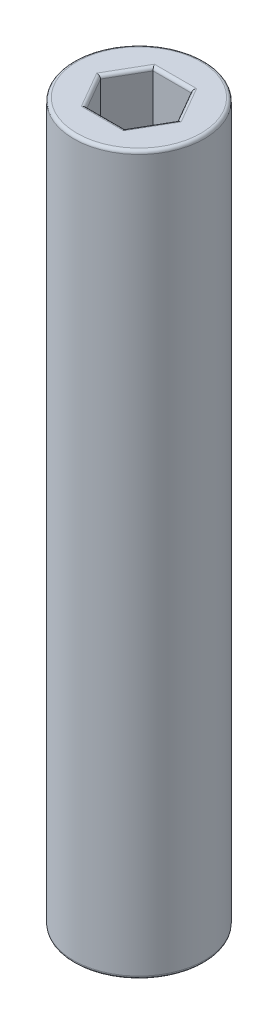
ISO-10303-21;
HEADER;
FILE_DESCRIPTION(('STEP AP214'),'2;1');
FILE_NAME('part.step','',(''),(''),'','','');
FILE_SCHEMA(('AUTOMOTIVE_DESIGN { 1 0 10303 214 1 1 1 1 }'));
ENDSEC;
DATA;
#1=APPLICATION_CONTEXT('core data for automotive mechanical design processes');
#2=APPLICATION_PROTOCOL_DEFINITION('international standard','automotive_design',2000,#1);
#3=PRODUCT_CONTEXT('',#1,'mechanical');
#4=PRODUCT('Part','Part','',(#3));
#5=PRODUCT_RELATED_PRODUCT_CATEGORY('part','',(#4));
#6=PRODUCT_DEFINITION_FORMATION('','',#4);
#7=PRODUCT_DEFINITION_CONTEXT('part definition',#1,'design');
#8=PRODUCT_DEFINITION('design','',#6,#7);
#9=PRODUCT_DEFINITION_SHAPE('','',#8);
#10=(LENGTH_UNIT() NAMED_UNIT(*) SI_UNIT(.MILLI.,.METRE.));
#11=(NAMED_UNIT(*) PLANE_ANGLE_UNIT() SI_UNIT($,.RADIAN.));
#12=(NAMED_UNIT(*) SI_UNIT($,.STERADIAN.) SOLID_ANGLE_UNIT());
#13=UNCERTAINTY_MEASURE_WITH_UNIT(LENGTH_MEASURE(1.E-05),#10,'distance_accuracy_value','');
#14=(GEOMETRIC_REPRESENTATION_CONTEXT(3) GLOBAL_UNCERTAINTY_ASSIGNED_CONTEXT((#13)) GLOBAL_UNIT_ASSIGNED_CONTEXT((#10,
#11,#12)) REPRESENTATION_CONTEXT('',''));
#15=CARTESIAN_POINT('',(0.,0.,0.));
#16=DIRECTION('',(0.,0.,1.));
#17=DIRECTION('',(1.,0.,0.));
#18=AXIS2_PLACEMENT_3D('',#15,#16,#17);
#19=CARTESIAN_POINT('',(0.,139.7,0.));
#20=DIRECTION('',(0.,1.,0.));
#21=DIRECTION('',(0.,0.,1.));
#22=AXIS2_PLACEMENT_3D('',#19,#20,#21);
#23=PLANE('',#22);
#24=DIRECTION('',(-0.499999999999995,0.,0.866025403784442));
#25=VECTOR('',#24,1.);
#26=CARTESIAN_POINT('',(-6.15917267171495,139.7,-3.55599999999996));
#27=LINE('',#26,#25);
#28=CARTESIAN_POINT('',(-8.21223022895324,139.7,0.));
#29=VERTEX_POINT('',#28);
#30=CARTESIAN_POINT('',(-4.10611511447665,139.7,-7.11199999999999));
#31=VERTEX_POINT('',#30);
#32=EDGE_CURVE('E198',#29,#31,#27,.F.);
#33=ORIENTED_EDGE('',*,*,#32,.T.);
#34=DIRECTION('',(-1.,0.,0.));
#35=VECTOR('',#34,1.);
#36=CARTESIAN_POINT('',(0.,139.7,-7.112));
#37=LINE('',#36,#35);
#38=CARTESIAN_POINT('',(4.1061151144766,139.7,-7.11200000000001));
#39=VERTEX_POINT('',#38);
#40=EDGE_CURVE('E201',#31,#39,#37,.F.);
#41=ORIENTED_EDGE('',*,*,#40,.T.);
#42=DIRECTION('',(-0.500000000000001,0.,-0.866025403784438));
#43=VECTOR('',#42,1.);
#44=CARTESIAN_POINT('',(6.15917267171492,139.7,-3.55600000000001));
#45=LINE('',#44,#43);
#46=CARTESIAN_POINT('',(8.21223022895324,139.7,0.));
#47=VERTEX_POINT('',#46);
#48=EDGE_CURVE('E166',#39,#47,#45,.F.);
#49=ORIENTED_EDGE('',*,*,#48,.T.);
#50=DIRECTION('',(0.499999999999995,0.,-0.866025403784442));
#51=VECTOR('',#50,1.);
#52=CARTESIAN_POINT('',(6.15917267171497,139.7,3.55599999999998));
#53=LINE('',#52,#51);
#54=CARTESIAN_POINT('',(4.1061151144767,139.7,7.11199999999996));
#55=VERTEX_POINT('',#54);
#56=EDGE_CURVE('E189',#47,#55,#53,.F.);
#57=ORIENTED_EDGE('',*,*,#56,.T.);
#58=DIRECTION('',(1.,0.,0.));
#59=VECTOR('',#58,1.);
#60=CARTESIAN_POINT('',(0.,139.7,7.112));
#61=LINE('',#60,#59);
#62=CARTESIAN_POINT('',(-4.10611511447655,139.7,7.11200000000004));
#63=VERTEX_POINT('',#62);
#64=EDGE_CURVE('E192',#55,#63,#61,.F.);
#65=ORIENTED_EDGE('',*,*,#64,.T.);
#66=DIRECTION('',(0.500000000000007,0.,0.866025403784435));
#67=VECTOR('',#66,1.);
#68=CARTESIAN_POINT('',(-6.1591726717149,139.7,3.55600000000005));
#69=LINE('',#68,#67);
#70=EDGE_CURVE('E195',#63,#29,#69,.F.);
#71=ORIENTED_EDGE('',*,*,#70,.T.);
#72=EDGE_LOOP('',(#33,#41,#49,#57,#65,#71));
#73=FACE_BOUND('',#72,.T.);
#74=CARTESIAN_POINT('',(0.,139.7,0.));
#75=DIRECTION('',(0.,1.,0.));
#76=DIRECTION('',(0.,0.,1.));
#77=AXIS2_PLACEMENT_3D('',#74,#75,#76);
#78=CIRCLE('',#77,12.065);
#79=CARTESIAN_POINT('',(0.,139.7,12.065));
#80=VERTEX_POINT('',#79);
#81=EDGE_CURVE('E178',#80,#80,#78,.T.);
#82=ORIENTED_EDGE('',*,*,#81,.T.);
#83=EDGE_LOOP('',(#82));
#84=FACE_BOUND('',#83,.T.);
#85=ADVANCED_FACE('F45',(#73,#84),#23,.T.);
#86=CARTESIAN_POINT('',(0.,0.,0.));
#87=DIRECTION('',(0.,1.,0.));
#88=DIRECTION('',(0.,0.,1.));
#89=AXIS2_PLACEMENT_3D('',#86,#87,#88);
#90=PLANE('',#89);
#91=DIRECTION('',(0.500000000000007,0.,0.866025403784435));
#92=VECTOR('',#91,1.);
#93=CARTESIAN_POINT('',(-4.28942382494426,0.,6.79450000000004));
#94=LINE('',#93,#92);
#95=CARTESIAN_POINT('',(-8.21223022895324,0.,0.));
#96=VERTEX_POINT('',#95);
#97=CARTESIAN_POINT('',(-4.10611511447655,0.,7.11200000000004));
#98=VERTEX_POINT('',#97);
#99=EDGE_CURVE('E55',#96,#98,#94,.T.);
#100=ORIENTED_EDGE('',*,*,#99,.T.);
#101=DIRECTION('',(1.,0.,0.));
#102=VECTOR('',#101,1.);
#103=CARTESIAN_POINT('',(3.73949769354129,0.,7.11199999999996));
#104=LINE('',#103,#102);
#105=CARTESIAN_POINT('',(4.1061151144767,0.,7.11199999999996));
#106=VERTEX_POINT('',#105);
#107=EDGE_CURVE('E11',#98,#106,#104,.T.);
#108=ORIENTED_EDGE('',*,*,#107,.T.);
#109=DIRECTION('',(0.499999999999995,0.,-0.866025403784442));
#110=VECTOR('',#109,1.);
#111=CARTESIAN_POINT('',(8.02892151848554,0.,0.317499999999996));
#112=LINE('',#111,#110);
#113=CARTESIAN_POINT('',(8.21223022895324,0.,0.));
#114=VERTEX_POINT('',#113);
#115=EDGE_CURVE('E242',#106,#114,#112,.T.);
#116=ORIENTED_EDGE('',*,*,#115,.T.);
#117=DIRECTION('',(-0.500000000000001,0.,-0.866025403784438));
#118=VECTOR('',#117,1.);
#119=CARTESIAN_POINT('',(4.28942382494431,0.,-6.79450000000001));
#120=LINE('',#119,#118);
#121=CARTESIAN_POINT('',(4.10611511447661,0.,-7.11200000000001));
#122=VERTEX_POINT('',#121);
#123=EDGE_CURVE('E245',#114,#122,#120,.T.);
#124=ORIENTED_EDGE('',*,*,#123,.T.);
#125=DIRECTION('',(-1.,0.,0.));
#126=VECTOR('',#125,1.);
#127=CARTESIAN_POINT('',(-3.73949769354124,0.,-7.11199999999999));
#128=LINE('',#127,#126);
#129=CARTESIAN_POINT('',(-4.10611511447665,0.,-7.11199999999999));
#130=VERTEX_POINT('',#129);
#131=EDGE_CURVE('E248',#122,#130,#128,.T.);
#132=ORIENTED_EDGE('',*,*,#131,.T.);
#133=DIRECTION('',(-0.499999999999995,0.,0.866025403784442));
#134=VECTOR('',#133,1.);
#135=CARTESIAN_POINT('',(-8.02892151848554,0.,-0.317499999999944));
#136=LINE('',#135,#134);
#137=EDGE_CURVE('E66',#130,#96,#136,.T.);
#138=ORIENTED_EDGE('',*,*,#137,.T.);
#139=EDGE_LOOP('',(#100,#108,#116,#124,#132,#138));
#140=FACE_BOUND('',#139,.T.);
#141=CARTESIAN_POINT('',(0.,0.,0.));
#142=DIRECTION('',(0.,1.,0.));
#143=DIRECTION('',(0.,0.,1.));
#144=AXIS2_PLACEMENT_3D('',#141,#142,#143);
#145=CIRCLE('',#144,12.065);
#146=CARTESIAN_POINT('',(0.,0.,12.065));
#147=VERTEX_POINT('',#146);
#148=EDGE_CURVE('E238',#147,#147,#145,.F.);
#149=ORIENTED_EDGE('',*,*,#148,.T.);
#150=EDGE_LOOP('',(#149));
#151=FACE_BOUND('',#150,.T.);
#152=ADVANCED_FACE('F335',(#140,#151),#90,.F.);
#153=CARTESIAN_POINT('',(0.,139.7,0.));
#154=DIRECTION('',(0.,-1.,0.));
#155=DIRECTION('',(0.,0.,-1.));
#156=AXIS2_PLACEMENT_3D('',#153,#154,#155);
#157=CYLINDRICAL_SURFACE('',#156,12.7);
#158=CARTESIAN_POINT('',(0.,139.065,0.));
#159=DIRECTION('',(0.,1.,0.));
#160=DIRECTION('',(0.,0.,1.));
#161=AXIS2_PLACEMENT_3D('',#158,#159,#160);
#162=CIRCLE('',#161,12.7);
#163=CARTESIAN_POINT('',(0.,139.065,12.7));
#164=VERTEX_POINT('',#163);
#165=EDGE_CURVE('E234',#164,#164,#162,.F.);
#166=ORIENTED_EDGE('',*,*,#165,.T.);
#167=EDGE_LOOP('',(#166));
#168=FACE_BOUND('',#167,.T.);
#169=CARTESIAN_POINT('',(0.,0.634999999999997,0.));
#170=DIRECTION('',(0.,1.,0.));
#171=DIRECTION('',(0.,0.,1.));
#172=AXIS2_PLACEMENT_3D('',#169,#170,#171);
#173=CIRCLE('',#172,12.7);
#174=CARTESIAN_POINT('',(0.,0.634999999999997,12.7));
#175=VERTEX_POINT('',#174);
#176=EDGE_CURVE('E148',#175,#175,#173,.T.);
#177=ORIENTED_EDGE('',*,*,#176,.T.);
#178=EDGE_LOOP('',(#177));
#179=FACE_BOUND('',#178,.T.);
#180=ADVANCED_FACE('F338',(#168,#179),#157,.T.);
#181=CARTESIAN_POINT('',(3.73949769354128,139.7,6.47699999999996));
#182=DIRECTION('',(-0.866025403784442,0.,-0.499999999999995));
#183=DIRECTION('',(-0.499999999999995,0.,0.866025403784442));
#184=AXIS2_PLACEMENT_3D('',#181,#182,#183);
#185=PLANE('',#184);
#186=DIRECTION('',(0.,-1.,0.));
#187=VECTOR('',#186,1.);
#188=CARTESIAN_POINT('',(3.73949769354128,139.7,6.47699999999996));
#189=LINE('',#188,#187);
#190=CARTESIAN_POINT('',(3.73949769354128,139.065,6.47699999999996));
#191=VERTEX_POINT('',#190);
#192=CARTESIAN_POINT('',(3.73949769354128,0.634999999999997,6.47699999999996));
#193=VERTEX_POINT('',#192);
#194=EDGE_CURVE('E271',#191,#193,#189,.T.);
#195=ORIENTED_EDGE('',*,*,#194,.F.);
#196=DIRECTION('',(0.499999999999995,0.,-0.866025403784442));
#197=VECTOR('',#196,1.);
#198=CARTESIAN_POINT('',(3.73949769354128,139.065,6.47699999999996));
#199=LINE('',#198,#197);
#200=CARTESIAN_POINT('',(7.47899538708242,139.065,0.));
#201=VERTEX_POINT('',#200);
#202=EDGE_CURVE('E226',#191,#201,#199,.T.);
#203=ORIENTED_EDGE('',*,*,#202,.T.);
#204=DIRECTION('',(0.,-1.,0.));
#205=VECTOR('',#204,1.);
#206=CARTESIAN_POINT('',(7.47899538708242,139.7,0.));
#207=LINE('',#206,#205);
#208=CARTESIAN_POINT('',(7.47899538708242,0.634999999999997,0.));
#209=VERTEX_POINT('',#208);
#210=EDGE_CURVE('E142',#201,#209,#207,.T.);
#211=ORIENTED_EDGE('',*,*,#210,.T.);
#212=DIRECTION('',(0.499999999999995,0.,-0.866025403784442));
#213=VECTOR('',#212,1.);
#214=CARTESIAN_POINT('',(3.73949769354128,0.635,6.47699999999996));
#215=LINE('',#214,#213);
#216=EDGE_CURVE('E223',#209,#193,#215,.F.);
#217=ORIENTED_EDGE('',*,*,#216,.T.);
#218=EDGE_LOOP('',(#195,#203,#211,#217));
#219=FACE_BOUND('',#218,.T.);
#220=ADVANCED_FACE('F305',(#219),#185,.T.);
#221=CARTESIAN_POINT('',(7.47899538708242,139.7,0.));
#222=DIRECTION('',(-0.866025403784438,0.,0.500000000000001));
#223=DIRECTION('',(0.500000000000001,0.,0.866025403784438));
#224=AXIS2_PLACEMENT_3D('',#221,#222,#223);
#225=PLANE('',#224);
#226=ORIENTED_EDGE('',*,*,#210,.F.);
#227=DIRECTION('',(-0.500000000000001,0.,-0.866025403784438));
#228=VECTOR('',#227,1.);
#229=CARTESIAN_POINT('',(7.47899538708242,139.065,0.));
#230=LINE('',#229,#228);
#231=CARTESIAN_POINT('',(3.73949769354119,139.065,-6.47700000000001));
#232=VERTEX_POINT('',#231);
#233=EDGE_CURVE('E136',#201,#232,#230,.T.);
#234=ORIENTED_EDGE('',*,*,#233,.T.);
#235=DIRECTION('',(0.,-1.,0.));
#236=VECTOR('',#235,1.);
#237=CARTESIAN_POINT('',(3.73949769354119,139.7,-6.47700000000001));
#238=LINE('',#237,#236);
#239=CARTESIAN_POINT('',(3.73949769354119,0.634999999999997,-6.47700000000001));
#240=VERTEX_POINT('',#239);
#241=EDGE_CURVE('E139',#232,#240,#238,.T.);
#242=ORIENTED_EDGE('',*,*,#241,.T.);
#243=DIRECTION('',(-0.500000000000001,0.,-0.866025403784438));
#244=VECTOR('',#243,1.);
#245=CARTESIAN_POINT('',(7.47899538708242,0.635,0.));
#246=LINE('',#245,#244);
#247=EDGE_CURVE('E149',#240,#209,#246,.F.);
#248=ORIENTED_EDGE('',*,*,#247,.T.);
#249=EDGE_LOOP('',(#226,#234,#242,#248));
#250=FACE_BOUND('',#249,.T.);
#251=ADVANCED_FACE('F138',(#250),#225,.T.);
#252=CARTESIAN_POINT('',(3.73949769354119,139.7,-6.47700000000001));
#253=DIRECTION('',(0.,0.,1.));
#254=DIRECTION('',(1.,0.,0.));
#255=AXIS2_PLACEMENT_3D('',#252,#253,#254);
#256=PLANE('',#255);
#257=ORIENTED_EDGE('',*,*,#241,.F.);
#258=DIRECTION('',(-1.,0.,0.));
#259=VECTOR('',#258,1.);
#260=CARTESIAN_POINT('',(3.73949769354119,139.065,-6.47700000000001));
#261=LINE('',#260,#259);
#262=CARTESIAN_POINT('',(-3.73949769354124,139.065,-6.47699999999999));
#263=VERTEX_POINT('',#262);
#264=EDGE_CURVE('E156',#232,#263,#261,.T.);
#265=ORIENTED_EDGE('',*,*,#264,.T.);
#266=DIRECTION('',(0.,-1.,0.));
#267=VECTOR('',#266,1.);
#268=CARTESIAN_POINT('',(-3.73949769354124,139.7,-6.47699999999999));
#269=LINE('',#268,#267);
#270=CARTESIAN_POINT('',(-3.73949769354124,0.634999999999997,-6.47699999999999));
#271=VERTEX_POINT('',#270);
#272=EDGE_CURVE('E161',#263,#271,#269,.T.);
#273=ORIENTED_EDGE('',*,*,#272,.T.);
#274=DIRECTION('',(-1.,0.,0.));
#275=VECTOR('',#274,1.);
#276=CARTESIAN_POINT('',(3.73949769354119,0.635,-6.47700000000001));
#277=LINE('',#276,#275);
#278=EDGE_CURVE('E159',#271,#240,#277,.F.);
#279=ORIENTED_EDGE('',*,*,#278,.T.);
#280=EDGE_LOOP('',(#257,#265,#273,#279));
#281=FACE_BOUND('',#280,.T.);
#282=ADVANCED_FACE('F153',(#281),#256,.T.);
#283=CARTESIAN_POINT('',(-3.73949769354124,139.7,-6.47699999999999));
#284=DIRECTION('',(0.866025403784442,0.,0.499999999999995));
#285=DIRECTION('',(0.499999999999995,0.,-0.866025403784442));
#286=AXIS2_PLACEMENT_3D('',#283,#284,#285);
#287=PLANE('',#286);
#288=ORIENTED_EDGE('',*,*,#272,.F.);
#289=DIRECTION('',(-0.499999999999995,0.,0.866025403784442));
#290=VECTOR('',#289,1.);
#291=CARTESIAN_POINT('',(-3.73949769354124,139.065,-6.47699999999999));
#292=LINE('',#291,#290);
#293=CARTESIAN_POINT('',(-7.47899538708242,139.065,0.));
#294=VERTEX_POINT('',#293);
#295=EDGE_CURVE('E207',#263,#294,#292,.T.);
#296=ORIENTED_EDGE('',*,*,#295,.T.);
#297=DIRECTION('',(0.,-1.,0.));
#298=VECTOR('',#297,1.);
#299=CARTESIAN_POINT('',(-7.47899538708242,139.7,0.));
#300=LINE('',#299,#298);
#301=CARTESIAN_POINT('',(-7.47899538708242,0.634999999999997,0.));
#302=VERTEX_POINT('',#301);
#303=EDGE_CURVE('E312',#294,#302,#300,.T.);
#304=ORIENTED_EDGE('',*,*,#303,.T.);
#305=DIRECTION('',(-0.499999999999995,0.,0.866025403784442));
#306=VECTOR('',#305,1.);
#307=CARTESIAN_POINT('',(-3.73949769354124,0.635,-6.47699999999999));
#308=LINE('',#307,#306);
#309=EDGE_CURVE('E204',#302,#271,#308,.F.);
#310=ORIENTED_EDGE('',*,*,#309,.T.);
#311=EDGE_LOOP('',(#288,#296,#304,#310));
#312=FACE_BOUND('',#311,.T.);
#313=ADVANCED_FACE('F365',(#312),#287,.T.);
#314=CARTESIAN_POINT('',(-7.47899538708242,139.7,0.));
#315=DIRECTION('',(0.866025403784435,0.,-0.500000000000007));
#316=DIRECTION('',(-0.500000000000007,0.,-0.866025403784435));
#317=AXIS2_PLACEMENT_3D('',#314,#315,#316);
#318=PLANE('',#317);
#319=ORIENTED_EDGE('',*,*,#303,.F.);
#320=DIRECTION('',(0.500000000000007,0.,0.866025403784435));
#321=VECTOR('',#320,1.);
#322=CARTESIAN_POINT('',(-7.47899538708242,139.065,0.));
#323=LINE('',#322,#321);
#324=CARTESIAN_POINT('',(-3.73949769354115,139.065,6.47700000000004));
#325=VERTEX_POINT('',#324);
#326=EDGE_CURVE('E213',#294,#325,#323,.T.);
#327=ORIENTED_EDGE('',*,*,#326,.T.);
#328=DIRECTION('',(0.,-1.,0.));
#329=VECTOR('',#328,1.);
#330=CARTESIAN_POINT('',(-3.73949769354115,139.7,6.47700000000004));
#331=LINE('',#330,#329);
#332=CARTESIAN_POINT('',(-3.73949769354115,0.634999999999997,6.47700000000004));
#333=VERTEX_POINT('',#332);
#334=EDGE_CURVE('E316',#325,#333,#331,.T.);
#335=ORIENTED_EDGE('',*,*,#334,.T.);
#336=DIRECTION('',(0.500000000000007,0.,0.866025403784435));
#337=VECTOR('',#336,1.);
#338=CARTESIAN_POINT('',(-7.47899538708242,0.635,0.));
#339=LINE('',#338,#337);
#340=EDGE_CURVE('E210',#333,#302,#339,.F.);
#341=ORIENTED_EDGE('',*,*,#340,.T.);
#342=EDGE_LOOP('',(#319,#327,#335,#341));
#343=FACE_BOUND('',#342,.T.);
#344=ADVANCED_FACE('F368',(#343),#318,.T.);
#345=CARTESIAN_POINT('',(-3.73949769354115,139.7,6.47700000000004));
#346=DIRECTION('',(0.,0.,-1.));
#347=DIRECTION('',(-1.,0.,0.));
#348=AXIS2_PLACEMENT_3D('',#345,#346,#347);
#349=PLANE('',#348);
#350=ORIENTED_EDGE('',*,*,#334,.F.);
#351=DIRECTION('',(1.,0.,0.));
#352=VECTOR('',#351,1.);
#353=CARTESIAN_POINT('',(-3.73949769354115,139.065,6.47700000000004));
#354=LINE('',#353,#352);
#355=EDGE_CURVE('E220',#325,#191,#354,.T.);
#356=ORIENTED_EDGE('',*,*,#355,.T.);
#357=ORIENTED_EDGE('',*,*,#194,.T.);
#358=DIRECTION('',(1.,0.,0.));
#359=VECTOR('',#358,1.);
#360=CARTESIAN_POINT('',(-3.73949769354115,0.635,6.47700000000004));
#361=LINE('',#360,#359);
#362=EDGE_CURVE('E216',#193,#333,#361,.F.);
#363=ORIENTED_EDGE('',*,*,#362,.T.);
#364=EDGE_LOOP('',(#350,#356,#357,#363));
#365=FACE_BOUND('',#364,.T.);
#366=ADVANCED_FACE('F324',(#365),#349,.T.);
#367=CARTESIAN_POINT('',(-3.73949769354114,139.065,7.11200000000004));
#368=DIRECTION('',(1.,0.,0.));
#369=DIRECTION('',(0.,0.,-1.));
#370=AXIS2_PLACEMENT_3D('',#367,#368,#369);
#371=CYLINDRICAL_SURFACE('',#370,0.635);
#372=CARTESIAN_POINT('',(-4.10611511447655,139.065,7.11200000000004));
#373=DIRECTION('',(0.866025403784443,0.,0.499999999999992));
#374=DIRECTION('',(-0.499999999999992,0.,0.866025403784443));
#375=AXIS2_PLACEMENT_3D('',#372,#373,#374);
#376=ELLIPSE('',#375,0.733234841870825,0.635);
#377=EDGE_CURVE('E263',#63,#325,#376,.F.);
#378=ORIENTED_EDGE('',*,*,#377,.F.);
#379=ORIENTED_EDGE('',*,*,#64,.F.);
#380=CARTESIAN_POINT('',(4.1061151144767,139.065,7.11199999999996));
#381=DIRECTION('',(0.866025403784435,0.,-0.500000000000007));
#382=DIRECTION('',(0.500000000000007,0.,0.866025403784435));
#383=AXIS2_PLACEMENT_3D('',#380,#381,#382);
#384=ELLIPSE('',#383,0.733234841870824,0.635);
#385=EDGE_CURVE('E267',#191,#55,#384,.T.);
#386=ORIENTED_EDGE('',*,*,#385,.F.);
#387=ORIENTED_EDGE('',*,*,#355,.F.);
#388=EDGE_LOOP('',(#378,#379,#386,#387));
#389=FACE_BOUND('',#388,.T.);
#390=ADVANCED_FACE('F374',(#389),#371,.T.);
#391=CARTESIAN_POINT('',(4.2894238249444,139.065,6.79449999999996));
#392=DIRECTION('',(0.499999999999995,0.,-0.866025403784442));
#393=DIRECTION('',(-0.866025403784442,0.,-0.499999999999995));
#394=AXIS2_PLACEMENT_3D('',#391,#392,#393);
#395=CYLINDRICAL_SURFACE('',#394,0.635);
#396=ORIENTED_EDGE('',*,*,#385,.T.);
#397=ORIENTED_EDGE('',*,*,#56,.F.);
#398=CARTESIAN_POINT('',(8.21223022895324,139.065,0.));
#399=DIRECTION('',(0.,0.,-1.));
#400=DIRECTION('',(1.,0.,0.));
#401=AXIS2_PLACEMENT_3D('',#398,#399,#400);
#402=ELLIPSE('',#401,0.733234841870824,0.635);
#403=EDGE_CURVE('E260',#201,#47,#402,.T.);
#404=ORIENTED_EDGE('',*,*,#403,.F.);
#405=ORIENTED_EDGE('',*,*,#202,.F.);
#406=EDGE_LOOP('',(#396,#397,#404,#405));
#407=FACE_BOUND('',#406,.T.);
#408=ADVANCED_FACE('F378',(#407),#395,.T.);
#409=CARTESIAN_POINT('',(-8.02892151848553,139.065,0.317500000000057));
#410=DIRECTION('',(0.500000000000007,0.,0.866025403784435));
#411=DIRECTION('',(0.866025403784435,0.,-0.500000000000007));
#412=AXIS2_PLACEMENT_3D('',#409,#410,#411);
#413=CYLINDRICAL_SURFACE('',#412,0.635);
#414=ORIENTED_EDGE('',*,*,#377,.T.);
#415=ORIENTED_EDGE('',*,*,#326,.F.);
#416=CARTESIAN_POINT('',(-8.21223022895324,139.065,0.));
#417=DIRECTION('',(0.,0.,1.));
#418=DIRECTION('',(-1.,0.,0.));
#419=AXIS2_PLACEMENT_3D('',#416,#417,#418);
#420=ELLIPSE('',#419,0.733234841870825,0.635);
#421=EDGE_CURVE('E171',#29,#294,#420,.F.);
#422=ORIENTED_EDGE('',*,*,#421,.F.);
#423=ORIENTED_EDGE('',*,*,#70,.F.);
#424=EDGE_LOOP('',(#414,#415,#422,#423));
#425=FACE_BOUND('',#424,.T.);
#426=ADVANCED_FACE('F384',(#425),#413,.T.);
#427=CARTESIAN_POINT('',(8.02892151848554,139.065,-0.317500000000001));
#428=DIRECTION('',(-0.500000000000001,0.,-0.866025403784438));
#429=DIRECTION('',(-0.866025403784438,0.,0.500000000000001));
#430=AXIS2_PLACEMENT_3D('',#427,#428,#429);
#431=CYLINDRICAL_SURFACE('',#430,0.635);
#432=ORIENTED_EDGE('',*,*,#403,.T.);
#433=ORIENTED_EDGE('',*,*,#48,.F.);
#434=CARTESIAN_POINT('',(4.1061151144766,139.065,-7.11200000000001));
#435=DIRECTION('',(-0.86602540378444,0.,-0.499999999999998));
#436=DIRECTION('',(-0.499999999999998,0.,0.86602540378444));
#437=AXIS2_PLACEMENT_3D('',#434,#435,#436);
#438=ELLIPSE('',#437,0.733234841870825,0.635);
#439=EDGE_CURVE('E164',#232,#39,#438,.T.);
#440=ORIENTED_EDGE('',*,*,#439,.F.);
#441=ORIENTED_EDGE('',*,*,#233,.F.);
#442=EDGE_LOOP('',(#432,#433,#440,#441));
#443=FACE_BOUND('',#442,.T.);
#444=ADVANCED_FACE('F165',(#443),#431,.T.);
#445=CARTESIAN_POINT('',(-4.28942382494436,139.065,-6.79449999999998));
#446=DIRECTION('',(-0.499999999999995,0.,0.866025403784442));
#447=DIRECTION('',(0.866025403784442,0.,0.499999999999995));
#448=AXIS2_PLACEMENT_3D('',#445,#446,#447);
#449=CYLINDRICAL_SURFACE('',#448,0.635);
#450=ORIENTED_EDGE('',*,*,#421,.T.);
#451=ORIENTED_EDGE('',*,*,#295,.F.);
#452=CARTESIAN_POINT('',(-4.10611511447665,139.065,-7.11199999999999));
#453=DIRECTION('',(-0.866025403784436,0.,0.500000000000004));
#454=DIRECTION('',(-0.500000000000004,0.,-0.866025403784436));
#455=AXIS2_PLACEMENT_3D('',#452,#453,#454);
#456=ELLIPSE('',#455,0.733234841870825,0.635);
#457=EDGE_CURVE('E172',#31,#263,#456,.F.);
#458=ORIENTED_EDGE('',*,*,#457,.F.);
#459=ORIENTED_EDGE('',*,*,#32,.F.);
#460=EDGE_LOOP('',(#450,#451,#458,#459));
#461=FACE_BOUND('',#460,.T.);
#462=ADVANCED_FACE('F477',(#461),#449,.T.);
#463=CARTESIAN_POINT('',(3.73949769354119,139.065,-7.11200000000001));
#464=DIRECTION('',(-1.,0.,0.));
#465=DIRECTION('',(0.,0.,1.));
#466=AXIS2_PLACEMENT_3D('',#463,#464,#465);
#467=CYLINDRICAL_SURFACE('',#466,0.635);
#468=ORIENTED_EDGE('',*,*,#439,.T.);
#469=ORIENTED_EDGE('',*,*,#40,.F.);
#470=ORIENTED_EDGE('',*,*,#457,.T.);
#471=ORIENTED_EDGE('',*,*,#264,.F.);
#472=EDGE_LOOP('',(#468,#469,#470,#471));
#473=FACE_BOUND('',#472,.T.);
#474=ADVANCED_FACE('F174',(#473),#467,.T.);
#475=CARTESIAN_POINT('',(0.,139.065,0.));
#476=DIRECTION('',(0.,1.,0.));
#477=DIRECTION('',(0.,0.,1.));
#478=AXIS2_PLACEMENT_3D('',#475,#476,#477);
#479=TOROIDAL_SURFACE('',#478,12.065,0.635);
#480=ORIENTED_EDGE('',*,*,#165,.F.);
#481=EDGE_LOOP('',(#480));
#482=FACE_BOUND('',#481,.T.);
#483=ORIENTED_EDGE('',*,*,#81,.F.);
#484=EDGE_LOOP('',(#483));
#485=FACE_BOUND('',#484,.T.);
#486=ADVANCED_FACE('F390',(#482,#485),#479,.T.);
#487=CARTESIAN_POINT('',(0.,0.635,-7.112));
#488=DIRECTION('',(1.,0.,0.));
#489=DIRECTION('',(0.,0.,-1.));
#490=AXIS2_PLACEMENT_3D('',#487,#488,#489);
#491=CYLINDRICAL_SURFACE('',#490,0.635);
#492=CARTESIAN_POINT('',(4.1061151144766,0.635,-7.11200000000001));
#493=DIRECTION('',(0.86602540378444,0.,0.499999999999998));
#494=DIRECTION('',(0.499999999999998,0.,-0.86602540378444));
#495=AXIS2_PLACEMENT_3D('',#492,#493,#494);
#496=ELLIPSE('',#495,0.733234841870825,0.635);
#497=EDGE_CURVE('E285',#240,#122,#496,.T.);
#498=ORIENTED_EDGE('',*,*,#497,.F.);
#499=ORIENTED_EDGE('',*,*,#278,.F.);
#500=CARTESIAN_POINT('',(-4.10611511447665,0.635,-7.11199999999999));
#501=DIRECTION('',(0.866025403784436,0.,-0.500000000000004));
#502=DIRECTION('',(-0.500000000000004,0.,-0.866025403784436));
#503=AXIS2_PLACEMENT_3D('',#500,#501,#502);
#504=ELLIPSE('',#503,0.733234841870825,0.635);
#505=EDGE_CURVE('E49',#130,#271,#504,.F.);
#506=ORIENTED_EDGE('',*,*,#505,.F.);
#507=ORIENTED_EDGE('',*,*,#131,.F.);
#508=EDGE_LOOP('',(#498,#499,#506,#507));
#509=FACE_BOUND('',#508,.T.);
#510=ADVANCED_FACE('F299',(#509),#491,.T.);
#511=CARTESIAN_POINT('',(-6.15917267171495,0.635,-3.55599999999996));
#512=DIRECTION('',(0.499999999999995,0.,-0.866025403784442));
#513=DIRECTION('',(-0.866025403784442,0.,-0.499999999999995));
#514=AXIS2_PLACEMENT_3D('',#511,#512,#513);
#515=CYLINDRICAL_SURFACE('',#514,0.635);
#516=ORIENTED_EDGE('',*,*,#505,.T.);
#517=ORIENTED_EDGE('',*,*,#309,.F.);
#518=CARTESIAN_POINT('',(-8.21223022895324,0.635,0.));
#519=DIRECTION('',(0.,0.,-1.));
#520=DIRECTION('',(-1.,0.,0.));
#521=AXIS2_PLACEMENT_3D('',#518,#519,#520);
#522=ELLIPSE('',#521,0.733234841870825,0.635);
#523=EDGE_CURVE('E282',#96,#302,#522,.F.);
#524=ORIENTED_EDGE('',*,*,#523,.F.);
#525=ORIENTED_EDGE('',*,*,#137,.F.);
#526=EDGE_LOOP('',(#516,#517,#524,#525));
#527=FACE_BOUND('',#526,.T.);
#528=ADVANCED_FACE('F296',(#527),#515,.T.);
#529=CARTESIAN_POINT('',(6.15917267171492,0.635,-3.55600000000001));
#530=DIRECTION('',(0.500000000000001,0.,0.866025403784438));
#531=DIRECTION('',(0.866025403784438,0.,-0.500000000000001));
#532=AXIS2_PLACEMENT_3D('',#529,#530,#531);
#533=CYLINDRICAL_SURFACE('',#532,0.635);
#534=ORIENTED_EDGE('',*,*,#497,.T.);
#535=ORIENTED_EDGE('',*,*,#123,.F.);
#536=CARTESIAN_POINT('',(8.21223022895324,0.635,0.));
#537=DIRECTION('',(0.,0.,1.));
#538=DIRECTION('',(1.,0.,0.));
#539=AXIS2_PLACEMENT_3D('',#536,#537,#538);
#540=ELLIPSE('',#539,0.733234841870824,0.635);
#541=EDGE_CURVE('E278',#209,#114,#540,.T.);
#542=ORIENTED_EDGE('',*,*,#541,.F.);
#543=ORIENTED_EDGE('',*,*,#247,.F.);
#544=EDGE_LOOP('',(#534,#535,#542,#543));
#545=FACE_BOUND('',#544,.T.);
#546=ADVANCED_FACE('F301',(#545),#533,.T.);
#547=CARTESIAN_POINT('',(-6.1591726717149,0.635,3.55600000000005));
#548=DIRECTION('',(-0.500000000000007,0.,-0.866025403784435));
#549=DIRECTION('',(-0.866025403784435,0.,0.500000000000007));
#550=AXIS2_PLACEMENT_3D('',#547,#548,#549);
#551=CYLINDRICAL_SURFACE('',#550,0.635);
#552=ORIENTED_EDGE('',*,*,#523,.T.);
#553=ORIENTED_EDGE('',*,*,#340,.F.);
#554=CARTESIAN_POINT('',(-4.10611511447655,0.635,7.11200000000004));
#555=DIRECTION('',(-0.866025403784443,0.,-0.499999999999992));
#556=DIRECTION('',(-0.499999999999992,0.,0.866025403784443));
#557=AXIS2_PLACEMENT_3D('',#554,#555,#556);
#558=ELLIPSE('',#557,0.733234841870825,0.635);
#559=EDGE_CURVE('E275',#98,#333,#558,.F.);
#560=ORIENTED_EDGE('',*,*,#559,.F.);
#561=ORIENTED_EDGE('',*,*,#99,.F.);
#562=EDGE_LOOP('',(#552,#553,#560,#561));
#563=FACE_BOUND('',#562,.T.);
#564=ADVANCED_FACE('F398',(#563),#551,.T.);
#565=CARTESIAN_POINT('',(6.15917267171497,0.635,3.55599999999998));
#566=DIRECTION('',(-0.499999999999995,0.,0.866025403784442));
#567=DIRECTION('',(0.866025403784442,0.,0.499999999999995));
#568=AXIS2_PLACEMENT_3D('',#565,#566,#567);
#569=CYLINDRICAL_SURFACE('',#568,0.635);
#570=ORIENTED_EDGE('',*,*,#541,.T.);
#571=ORIENTED_EDGE('',*,*,#115,.F.);
#572=CARTESIAN_POINT('',(4.1061151144767,0.635,7.11199999999996));
#573=DIRECTION('',(-0.866025403784435,0.,0.500000000000007));
#574=DIRECTION('',(-0.500000000000007,0.,-0.866025403784435));
#575=AXIS2_PLACEMENT_3D('',#572,#573,#574);
#576=ELLIPSE('',#575,0.733234841870824,0.635);
#577=EDGE_CURVE('E272',#193,#106,#576,.T.);
#578=ORIENTED_EDGE('',*,*,#577,.F.);
#579=ORIENTED_EDGE('',*,*,#216,.F.);
#580=EDGE_LOOP('',(#570,#571,#578,#579));
#581=FACE_BOUND('',#580,.T.);
#582=ADVANCED_FACE('F334',(#581),#569,.T.);
#583=CARTESIAN_POINT('',(0.,0.635,7.112));
#584=DIRECTION('',(-1.,0.,0.));
#585=DIRECTION('',(0.,0.,1.));
#586=AXIS2_PLACEMENT_3D('',#583,#584,#585);
#587=CYLINDRICAL_SURFACE('',#586,0.635);
#588=ORIENTED_EDGE('',*,*,#559,.T.);
#589=ORIENTED_EDGE('',*,*,#362,.F.);
#590=ORIENTED_EDGE('',*,*,#577,.T.);
#591=ORIENTED_EDGE('',*,*,#107,.F.);
#592=EDGE_LOOP('',(#588,#589,#590,#591));
#593=FACE_BOUND('',#592,.T.);
#594=ADVANCED_FACE('F329',(#593),#587,.T.);
#595=CARTESIAN_POINT('',(0.,0.634999999999997,0.));
#596=DIRECTION('',(0.,1.,0.));
#597=DIRECTION('',(0.,0.,1.));
#598=AXIS2_PLACEMENT_3D('',#595,#596,#597);
#599=TOROIDAL_SURFACE('',#598,12.065,0.635);
#600=ORIENTED_EDGE('',*,*,#148,.F.);
#601=EDGE_LOOP('',(#600));
#602=FACE_BOUND('',#601,.T.);
#603=ORIENTED_EDGE('',*,*,#176,.F.);
#604=EDGE_LOOP('',(#603));
#605=FACE_BOUND('',#604,.T.);
#606=ADVANCED_FACE('F47',(#602,#605),#599,.T.);
#607=CLOSED_SHELL('',(#85,#152,#180,#220,#251,#282,#313,#344,#366,#390,#408,#426,#444,#462,#474,
#486,#510,#528,#546,#564,#582,#594,#606));
#608=MANIFOLD_SOLID_BREP('B2',#607);
#609=ADVANCED_BREP_SHAPE_REPRESENTATION('',(#18,#608),#14);
#610=SHAPE_DEFINITION_REPRESENTATION(#9,#609);
ENDSEC;
END-ISO-10303-21;
